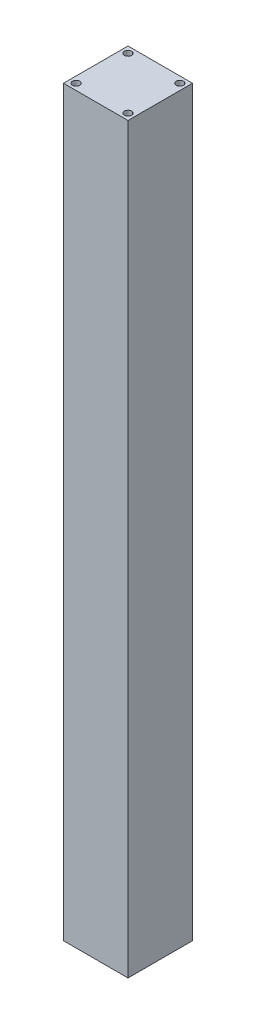
ISO-10303-21;
HEADER;
FILE_DESCRIPTION(('STEP AP214'),'2;1');
FILE_NAME('part.step','',(''),(''),'','','');
FILE_SCHEMA(('AUTOMOTIVE_DESIGN { 1 0 10303 214 1 1 1 1 }'));
ENDSEC;
DATA;
#1=APPLICATION_CONTEXT('core data for automotive mechanical design processes');
#2=APPLICATION_PROTOCOL_DEFINITION('international standard','automotive_design',2000,#1);
#3=PRODUCT_CONTEXT('',#1,'mechanical');
#4=PRODUCT('Part','Part','',(#3));
#5=PRODUCT_RELATED_PRODUCT_CATEGORY('part','',(#4));
#6=PRODUCT_DEFINITION_FORMATION('','',#4);
#7=PRODUCT_DEFINITION_CONTEXT('part definition',#1,'design');
#8=PRODUCT_DEFINITION('design','',#6,#7);
#9=PRODUCT_DEFINITION_SHAPE('','',#8);
#10=(LENGTH_UNIT() NAMED_UNIT(*) SI_UNIT(.MILLI.,.METRE.));
#11=(NAMED_UNIT(*) PLANE_ANGLE_UNIT() SI_UNIT($,.RADIAN.));
#12=(NAMED_UNIT(*) SI_UNIT($,.STERADIAN.) SOLID_ANGLE_UNIT());
#13=UNCERTAINTY_MEASURE_WITH_UNIT(LENGTH_MEASURE(1.E-05),#10,'distance_accuracy_value','');
#14=(GEOMETRIC_REPRESENTATION_CONTEXT(3) GLOBAL_UNCERTAINTY_ASSIGNED_CONTEXT((#13)) GLOBAL_UNIT_ASSIGNED_CONTEXT((#10,
#11,#12)) REPRESENTATION_CONTEXT('',''));
#15=CARTESIAN_POINT('',(0.,0.,0.));
#16=DIRECTION('',(0.,0.,1.));
#17=DIRECTION('',(1.,0.,0.));
#18=AXIS2_PLACEMENT_3D('',#15,#16,#17);
#19=CARTESIAN_POINT('',(0.,863.6,0.));
#20=DIRECTION('',(1.,0.,0.));
#21=DIRECTION('',(0.,0.,-1.));
#22=AXIS2_PLACEMENT_3D('',#19,#20,#21);
#23=PLANE('',#22);
#24=DIRECTION('',(0.,0.,1.));
#25=VECTOR('',#24,1.);
#26=CARTESIAN_POINT('',(0.,0.,0.));
#27=LINE('',#26,#25);
#28=CARTESIAN_POINT('',(0.,0.,-75.));
#29=VERTEX_POINT('',#28);
#30=CARTESIAN_POINT('',(0.,0.,0.));
#31=VERTEX_POINT('',#30);
#32=EDGE_CURVE('E113',#29,#31,#27,.T.);
#33=ORIENTED_EDGE('',*,*,#32,.T.);
#34=DIRECTION('',(0.,-1.,0.));
#35=VECTOR('',#34,1.);
#36=CARTESIAN_POINT('',(0.,863.6,0.));
#37=LINE('',#36,#35);
#38=CARTESIAN_POINT('',(0.,863.6,0.));
#39=VERTEX_POINT('',#38);
#40=EDGE_CURVE('E11',#39,#31,#37,.T.);
#41=ORIENTED_EDGE('',*,*,#40,.F.);
#42=DIRECTION('',(0.,0.,1.));
#43=VECTOR('',#42,1.);
#44=CARTESIAN_POINT('',(0.,863.6,0.));
#45=LINE('',#44,#43);
#46=CARTESIAN_POINT('',(0.,863.6,-75.));
#47=VERTEX_POINT('',#46);
#48=EDGE_CURVE('E97',#47,#39,#45,.T.);
#49=ORIENTED_EDGE('',*,*,#48,.F.);
#50=DIRECTION('',(0.,-1.,0.));
#51=VECTOR('',#50,1.);
#52=CARTESIAN_POINT('',(0.,863.6,-75.));
#53=LINE('',#52,#51);
#54=EDGE_CURVE('E109',#47,#29,#53,.T.);
#55=ORIENTED_EDGE('',*,*,#54,.T.);
#56=EDGE_LOOP('',(#33,#41,#49,#55));
#57=FACE_BOUND('',#56,.T.);
#58=ADVANCED_FACE('F45',(#57),#23,.F.);
#59=CARTESIAN_POINT('',(0.,863.6,0.));
#60=DIRECTION('',(0.,0.,-1.));
#61=DIRECTION('',(-1.,0.,0.));
#62=AXIS2_PLACEMENT_3D('',#59,#60,#61);
#63=PLANE('',#62);
#64=DIRECTION('',(1.,0.,0.));
#65=VECTOR('',#64,1.);
#66=CARTESIAN_POINT('',(0.,0.,0.));
#67=LINE('',#66,#65);
#68=CARTESIAN_POINT('',(75.,0.,0.));
#69=VERTEX_POINT('',#68);
#70=EDGE_CURVE('E102',#31,#69,#67,.T.);
#71=ORIENTED_EDGE('',*,*,#70,.T.);
#72=DIRECTION('',(0.,-1.,0.));
#73=VECTOR('',#72,1.);
#74=CARTESIAN_POINT('',(75.,863.6,0.));
#75=LINE('',#74,#73);
#76=CARTESIAN_POINT('',(75.,863.6,0.));
#77=VERTEX_POINT('',#76);
#78=EDGE_CURVE('E54',#77,#69,#75,.T.);
#79=ORIENTED_EDGE('',*,*,#78,.F.);
#80=DIRECTION('',(1.,0.,0.));
#81=VECTOR('',#80,1.);
#82=CARTESIAN_POINT('',(0.,863.6,0.));
#83=LINE('',#82,#81);
#84=EDGE_CURVE('E92',#39,#77,#83,.T.);
#85=ORIENTED_EDGE('',*,*,#84,.F.);
#86=ORIENTED_EDGE('',*,*,#40,.T.);
#87=EDGE_LOOP('',(#71,#79,#85,#86));
#88=FACE_BOUND('',#87,.T.);
#89=ADVANCED_FACE('F101',(#88),#63,.F.);
#90=CARTESIAN_POINT('',(75.,863.6,0.));
#91=DIRECTION('',(-1.,0.,0.));
#92=DIRECTION('',(0.,0.,1.));
#93=AXIS2_PLACEMENT_3D('',#90,#91,#92);
#94=PLANE('',#93);
#95=DIRECTION('',(0.,0.,-1.));
#96=VECTOR('',#95,1.);
#97=CARTESIAN_POINT('',(75.,0.,0.));
#98=LINE('',#97,#96);
#99=CARTESIAN_POINT('',(75.,0.,-75.));
#100=VERTEX_POINT('',#99);
#101=EDGE_CURVE('E79',#69,#100,#98,.T.);
#102=ORIENTED_EDGE('',*,*,#101,.T.);
#103=DIRECTION('',(0.,-1.,0.));
#104=VECTOR('',#103,1.);
#105=CARTESIAN_POINT('',(75.,863.6,-75.));
#106=LINE('',#105,#104);
#107=CARTESIAN_POINT('',(75.,863.6,-75.));
#108=VERTEX_POINT('',#107);
#109=EDGE_CURVE('E104',#108,#100,#106,.T.);
#110=ORIENTED_EDGE('',*,*,#109,.F.);
#111=DIRECTION('',(0.,0.,-1.));
#112=VECTOR('',#111,1.);
#113=CARTESIAN_POINT('',(75.,863.6,0.));
#114=LINE('',#113,#112);
#115=EDGE_CURVE('E95',#77,#108,#114,.T.);
#116=ORIENTED_EDGE('',*,*,#115,.F.);
#117=ORIENTED_EDGE('',*,*,#78,.T.);
#118=EDGE_LOOP('',(#102,#110,#116,#117));
#119=FACE_BOUND('',#118,.T.);
#120=ADVANCED_FACE('F105',(#119),#94,.F.);
#121=CARTESIAN_POINT('',(0.,863.6,-75.));
#122=DIRECTION('',(0.,0.,1.));
#123=DIRECTION('',(1.,0.,0.));
#124=AXIS2_PLACEMENT_3D('',#121,#122,#123);
#125=PLANE('',#124);
#126=DIRECTION('',(-1.,0.,0.));
#127=VECTOR('',#126,1.);
#128=CARTESIAN_POINT('',(0.,0.,-75.));
#129=LINE('',#128,#127);
#130=EDGE_CURVE('E85',#100,#29,#129,.T.);
#131=ORIENTED_EDGE('',*,*,#130,.T.);
#132=ORIENTED_EDGE('',*,*,#54,.F.);
#133=DIRECTION('',(-1.,0.,0.));
#134=VECTOR('',#133,1.);
#135=CARTESIAN_POINT('',(0.,863.6,-75.));
#136=LINE('',#135,#134);
#137=EDGE_CURVE('E62',#108,#47,#136,.T.);
#138=ORIENTED_EDGE('',*,*,#137,.F.);
#139=ORIENTED_EDGE('',*,*,#109,.T.);
#140=EDGE_LOOP('',(#131,#132,#138,#139));
#141=FACE_BOUND('',#140,.T.);
#142=ADVANCED_FACE('F127',(#141),#125,.F.);
#143=CARTESIAN_POINT('',(0.,863.6,0.));
#144=DIRECTION('',(0.,-1.,0.));
#145=DIRECTION('',(0.,0.,-1.));
#146=AXIS2_PLACEMENT_3D('',#143,#144,#145);
#147=PLANE('',#146);
#148=CARTESIAN_POINT('',(67.6625,863.6,-67.6625));
#149=DIRECTION('',(0.,-1.,0.));
#150=DIRECTION('',(0.,0.,-1.));
#151=AXIS2_PLACEMENT_3D('',#148,#149,#150);
#152=CIRCLE('',#151,4.233291);
#153=CARTESIAN_POINT('',(67.6625,863.6,-71.895791));
#154=VERTEX_POINT('',#153);
#155=EDGE_CURVE('E138',#154,#154,#152,.T.);
#156=ORIENTED_EDGE('',*,*,#155,.T.);
#157=EDGE_LOOP('',(#156));
#158=FACE_BOUND('',#157,.T.);
#159=CARTESIAN_POINT('',(7.33750000000002,863.6,-7.33750000000005));
#160=DIRECTION('',(0.,-1.,0.));
#161=DIRECTION('',(0.,0.,-1.));
#162=AXIS2_PLACEMENT_3D('',#159,#160,#161);
#163=CIRCLE('',#162,4.23329100000001);
#164=CARTESIAN_POINT('',(7.33750000000002,863.6,-11.5707910000001));
#165=VERTEX_POINT('',#164);
#166=EDGE_CURVE('E146',#165,#165,#163,.T.);
#167=ORIENTED_EDGE('',*,*,#166,.T.);
#168=EDGE_LOOP('',(#167));
#169=FACE_BOUND('',#168,.T.);
#170=CARTESIAN_POINT('',(67.6625,863.6,-7.33750000000005));
#171=DIRECTION('',(0.,-1.,0.));
#172=DIRECTION('',(0.,0.,-1.));
#173=AXIS2_PLACEMENT_3D('',#170,#171,#172);
#174=CIRCLE('',#173,4.233291);
#175=CARTESIAN_POINT('',(67.6625,863.6,-11.570791));
#176=VERTEX_POINT('',#175);
#177=EDGE_CURVE('E147',#176,#176,#174,.T.);
#178=ORIENTED_EDGE('',*,*,#177,.T.);
#179=EDGE_LOOP('',(#178));
#180=FACE_BOUND('',#179,.T.);
#181=CARTESIAN_POINT('',(7.33750000000002,863.6,-67.6625));
#182=DIRECTION('',(0.,-1.,0.));
#183=DIRECTION('',(0.,0.,-1.));
#184=AXIS2_PLACEMENT_3D('',#181,#182,#183);
#185=CIRCLE('',#184,4.23329100000002);
#186=CARTESIAN_POINT('',(7.33750000000002,863.6,-71.895791));
#187=VERTEX_POINT('',#186);
#188=EDGE_CURVE('E134',#187,#187,#185,.T.);
#189=ORIENTED_EDGE('',*,*,#188,.T.);
#190=EDGE_LOOP('',(#189));
#191=FACE_BOUND('',#190,.T.);
#192=ORIENTED_EDGE('',*,*,#48,.T.);
#193=ORIENTED_EDGE('',*,*,#84,.T.);
#194=ORIENTED_EDGE('',*,*,#115,.T.);
#195=ORIENTED_EDGE('',*,*,#137,.T.);
#196=EDGE_LOOP('',(#192,#193,#194,#195));
#197=FACE_BOUND('',#196,.T.);
#198=ADVANCED_FACE('F93',(#158,#169,#180,#191,#197),#147,.F.);
#199=CARTESIAN_POINT('',(0.,0.,0.));
#200=DIRECTION('',(0.,-1.,0.));
#201=DIRECTION('',(0.,0.,-1.));
#202=AXIS2_PLACEMENT_3D('',#199,#200,#201);
#203=PLANE('',#202);
#204=ORIENTED_EDGE('',*,*,#32,.F.);
#205=ORIENTED_EDGE('',*,*,#130,.F.);
#206=ORIENTED_EDGE('',*,*,#101,.F.);
#207=ORIENTED_EDGE('',*,*,#70,.F.);
#208=EDGE_LOOP('',(#204,#205,#206,#207));
#209=FACE_BOUND('',#208,.T.);
#210=ADVANCED_FACE('F130',(#209),#203,.T.);
#211=CARTESIAN_POINT('',(7.33750000000002,838.2,-67.6625));
#212=DIRECTION('',(0.,1.,0.));
#213=DIRECTION('',(0.,0.,1.));
#214=AXIS2_PLACEMENT_3D('',#211,#212,#213);
#215=CYLINDRICAL_SURFACE('',#214,4.23329100000002);
#216=CARTESIAN_POINT('',(7.33750000000002,838.2,-67.6625));
#217=DIRECTION('',(0.,-1.,0.));
#218=DIRECTION('',(0.,0.,-1.));
#219=AXIS2_PLACEMENT_3D('',#216,#217,#218);
#220=CIRCLE('',#219,4.23329100000002);
#221=CARTESIAN_POINT('',(7.33750000000002,838.2,-71.895791));
#222=VERTEX_POINT('',#221);
#223=EDGE_CURVE('E117',#222,#222,#220,.T.);
#224=ORIENTED_EDGE('',*,*,#223,.T.);
#225=EDGE_LOOP('',(#224));
#226=FACE_BOUND('',#225,.T.);
#227=ORIENTED_EDGE('',*,*,#188,.F.);
#228=EDGE_LOOP('',(#227));
#229=FACE_BOUND('',#228,.T.);
#230=ADVANCED_FACE('F181',(#226,#229),#215,.F.);
#231=CARTESIAN_POINT('',(7.33750000000002,838.2,-67.6625));
#232=DIRECTION('',(0.,-1.,0.));
#233=DIRECTION('',(0.,0.,-1.));
#234=AXIS2_PLACEMENT_3D('',#231,#232,#233);
#235=PLANE('',#234);
#236=ORIENTED_EDGE('',*,*,#223,.F.);
#237=EDGE_LOOP('',(#236));
#238=FACE_BOUND('',#237,.T.);
#239=ADVANCED_FACE('F171',(#238),#235,.F.);
#240=CARTESIAN_POINT('',(67.6625,838.2,-7.33750000000005));
#241=DIRECTION('',(0.,1.,0.));
#242=DIRECTION('',(0.,0.,1.));
#243=AXIS2_PLACEMENT_3D('',#240,#241,#242);
#244=CYLINDRICAL_SURFACE('',#243,4.233291);
#245=CARTESIAN_POINT('',(67.6625,838.2,-7.33750000000005));
#246=DIRECTION('',(0.,-1.,0.));
#247=DIRECTION('',(0.,0.,-1.));
#248=AXIS2_PLACEMENT_3D('',#245,#246,#247);
#249=CIRCLE('',#248,4.233291);
#250=CARTESIAN_POINT('',(67.6625,838.2,-11.570791));
#251=VERTEX_POINT('',#250);
#252=EDGE_CURVE('E158',#251,#251,#249,.T.);
#253=ORIENTED_EDGE('',*,*,#252,.T.);
#254=EDGE_LOOP('',(#253));
#255=FACE_BOUND('',#254,.T.);
#256=ORIENTED_EDGE('',*,*,#177,.F.);
#257=EDGE_LOOP('',(#256));
#258=FACE_BOUND('',#257,.T.);
#259=ADVANCED_FACE('F168',(#255,#258),#244,.F.);
#260=CARTESIAN_POINT('',(67.6625,838.2,-7.33750000000005));
#261=DIRECTION('',(0.,-1.,0.));
#262=DIRECTION('',(0.,0.,-1.));
#263=AXIS2_PLACEMENT_3D('',#260,#261,#262);
#264=PLANE('',#263);
#265=ORIENTED_EDGE('',*,*,#252,.F.);
#266=EDGE_LOOP('',(#265));
#267=FACE_BOUND('',#266,.T.);
#268=ADVANCED_FACE('F170',(#267),#264,.F.);
#269=CARTESIAN_POINT('',(7.33750000000002,838.2,-7.33750000000005));
#270=DIRECTION('',(0.,1.,0.));
#271=DIRECTION('',(0.,0.,1.));
#272=AXIS2_PLACEMENT_3D('',#269,#270,#271);
#273=CYLINDRICAL_SURFACE('',#272,4.23329100000001);
#274=CARTESIAN_POINT('',(7.33750000000002,838.2,-7.33750000000005));
#275=DIRECTION('',(0.,-1.,0.));
#276=DIRECTION('',(0.,0.,-1.));
#277=AXIS2_PLACEMENT_3D('',#274,#275,#276);
#278=CIRCLE('',#277,4.23329100000001);
#279=CARTESIAN_POINT('',(7.33750000000002,838.2,-11.5707910000001));
#280=VERTEX_POINT('',#279);
#281=EDGE_CURVE('E142',#280,#280,#278,.T.);
#282=ORIENTED_EDGE('',*,*,#281,.T.);
#283=EDGE_LOOP('',(#282));
#284=FACE_BOUND('',#283,.T.);
#285=ORIENTED_EDGE('',*,*,#166,.F.);
#286=EDGE_LOOP('',(#285));
#287=FACE_BOUND('',#286,.T.);
#288=ADVANCED_FACE('F178',(#284,#287),#273,.F.);
#289=CARTESIAN_POINT('',(7.33750000000002,838.2,-7.33750000000005));
#290=DIRECTION('',(0.,-1.,0.));
#291=DIRECTION('',(0.,0.,-1.));
#292=AXIS2_PLACEMENT_3D('',#289,#290,#291);
#293=PLANE('',#292);
#294=ORIENTED_EDGE('',*,*,#281,.F.);
#295=EDGE_LOOP('',(#294));
#296=FACE_BOUND('',#295,.T.);
#297=ADVANCED_FACE('F203',(#296),#293,.F.);
#298=CARTESIAN_POINT('',(67.6625,838.2,-67.6625));
#299=DIRECTION('',(0.,1.,0.));
#300=DIRECTION('',(0.,0.,1.));
#301=AXIS2_PLACEMENT_3D('',#298,#299,#300);
#302=CYLINDRICAL_SURFACE('',#301,4.233291);
#303=CARTESIAN_POINT('',(67.6625,838.2,-67.6625));
#304=DIRECTION('',(0.,-1.,0.));
#305=DIRECTION('',(0.,0.,-1.));
#306=AXIS2_PLACEMENT_3D('',#303,#304,#305);
#307=CIRCLE('',#306,4.233291);
#308=CARTESIAN_POINT('',(67.6625,838.2,-71.895791));
#309=VERTEX_POINT('',#308);
#310=EDGE_CURVE('E151',#309,#309,#307,.T.);
#311=ORIENTED_EDGE('',*,*,#310,.T.);
#312=EDGE_LOOP('',(#311));
#313=FACE_BOUND('',#312,.T.);
#314=ORIENTED_EDGE('',*,*,#155,.F.);
#315=EDGE_LOOP('',(#314));
#316=FACE_BOUND('',#315,.T.);
#317=ADVANCED_FACE('F206',(#313,#316),#302,.F.);
#318=CARTESIAN_POINT('',(67.6625,838.2,-67.6625));
#319=DIRECTION('',(0.,-1.,0.));
#320=DIRECTION('',(0.,0.,-1.));
#321=AXIS2_PLACEMENT_3D('',#318,#319,#320);
#322=PLANE('',#321);
#323=ORIENTED_EDGE('',*,*,#310,.F.);
#324=EDGE_LOOP('',(#323));
#325=FACE_BOUND('',#324,.T.);
#326=ADVANCED_FACE('F211',(#325),#322,.F.);
#327=CLOSED_SHELL('',(#58,#89,#120,#142,#198,#210,#230,#239,#259,#268,#288,#297,#317,#326));
#328=MANIFOLD_SOLID_BREP('B2',#327);
#329=ADVANCED_BREP_SHAPE_REPRESENTATION('',(#18,#328),#14);
#330=SHAPE_DEFINITION_REPRESENTATION(#9,#329);
ENDSEC;
END-ISO-10303-21;
